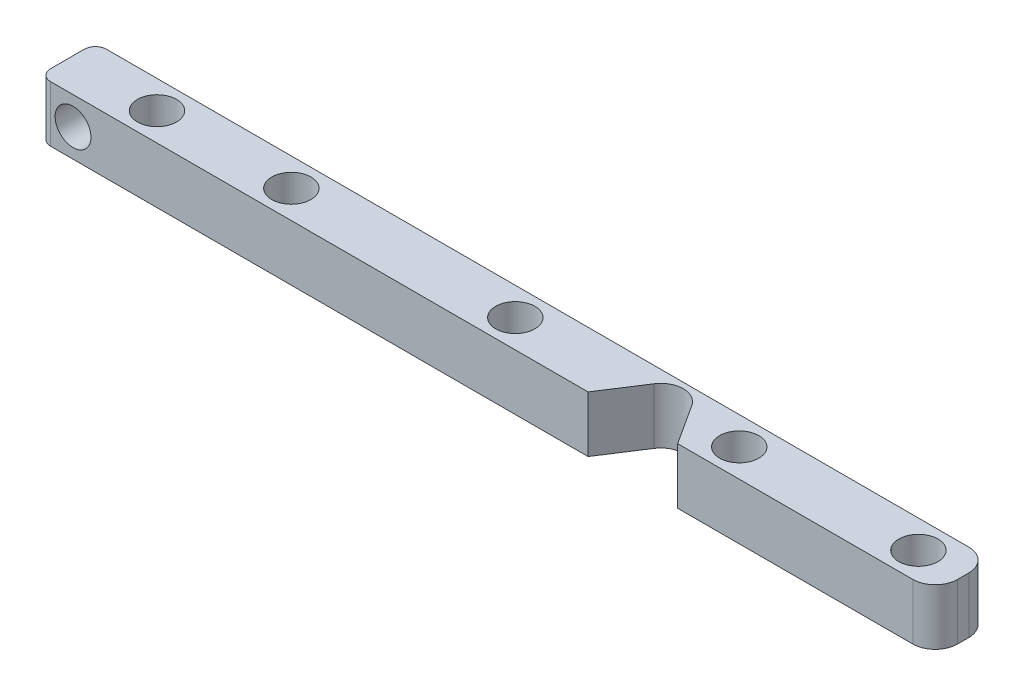
ISO-10303-21;
HEADER;
FILE_DESCRIPTION(('STEP AP214'),'2;1');
FILE_NAME('part.step','',(''),(''),'','','');
FILE_SCHEMA(('AUTOMOTIVE_DESIGN { 1 0 10303 214 1 1 1 1 }'));
ENDSEC;
DATA;
#1=APPLICATION_CONTEXT('core data for automotive mechanical design processes');
#2=APPLICATION_PROTOCOL_DEFINITION('international standard','automotive_design',2000,#1);
#3=PRODUCT_CONTEXT('',#1,'mechanical');
#4=PRODUCT('Part','Part','',(#3));
#5=PRODUCT_RELATED_PRODUCT_CATEGORY('part','',(#4));
#6=PRODUCT_DEFINITION_FORMATION('','',#4);
#7=PRODUCT_DEFINITION_CONTEXT('part definition',#1,'design');
#8=PRODUCT_DEFINITION('design','',#6,#7);
#9=PRODUCT_DEFINITION_SHAPE('','',#8);
#10=(LENGTH_UNIT() NAMED_UNIT(*) SI_UNIT(.MILLI.,.METRE.));
#11=(NAMED_UNIT(*) PLANE_ANGLE_UNIT() SI_UNIT($,.RADIAN.));
#12=(NAMED_UNIT(*) SI_UNIT($,.STERADIAN.) SOLID_ANGLE_UNIT());
#13=UNCERTAINTY_MEASURE_WITH_UNIT(LENGTH_MEASURE(1.E-05),#10,'distance_accuracy_value','');
#14=(GEOMETRIC_REPRESENTATION_CONTEXT(3) GLOBAL_UNCERTAINTY_ASSIGNED_CONTEXT((#13)) GLOBAL_UNIT_ASSIGNED_CONTEXT((#10,
#11,#12)) REPRESENTATION_CONTEXT('',''));
#15=CARTESIAN_POINT('',(0.,0.,0.));
#16=DIRECTION('',(0.,0.,1.));
#17=DIRECTION('',(1.,0.,0.));
#18=AXIS2_PLACEMENT_3D('',#15,#16,#17);
#19=CARTESIAN_POINT('',(0.,6.35,3.175));
#20=DIRECTION('',(0.,0.,-1.));
#21=DIRECTION('',(-1.,0.,0.));
#22=AXIS2_PLACEMENT_3D('',#19,#20,#21);
#23=PLANE('',#22);
#24=DIRECTION('',(0.,1.,0.));
#25=VECTOR('',#24,1.);
#26=CARTESIAN_POINT('',(21.59,-0.00100000000000013,3.175));
#27=LINE('',#26,#25);
#28=CARTESIAN_POINT('',(21.59,0.,3.175));
#29=VERTEX_POINT('',#28);
#30=CARTESIAN_POINT('',(21.59,6.35,3.175));
#31=VERTEX_POINT('',#30);
#32=EDGE_CURVE('E177',#29,#31,#27,.T.);
#33=ORIENTED_EDGE('',*,*,#32,.F.);
#34=DIRECTION('',(1.,0.,0.));
#35=VECTOR('',#34,1.);
#36=CARTESIAN_POINT('',(0.,0.,3.175));
#37=LINE('',#36,#35);
#38=CARTESIAN_POINT('',(48.26,0.,3.175));
#39=VERTEX_POINT('',#38);
#40=EDGE_CURVE('E245',#29,#39,#37,.T.);
#41=ORIENTED_EDGE('',*,*,#40,.T.);
#42=DIRECTION('',(0.,-1.,0.));
#43=VECTOR('',#42,1.);
#44=CARTESIAN_POINT('',(48.26,6.35,3.175));
#45=LINE('',#44,#43);
#46=CARTESIAN_POINT('',(48.26,6.35,3.175));
#47=VERTEX_POINT('',#46);
#48=EDGE_CURVE('E265',#39,#47,#45,.F.);
#49=ORIENTED_EDGE('',*,*,#48,.T.);
#50=DIRECTION('',(1.,0.,0.));
#51=VECTOR('',#50,1.);
#52=CARTESIAN_POINT('',(0.,6.35,3.175));
#53=LINE('',#52,#51);
#54=EDGE_CURVE('E235',#31,#47,#53,.T.);
#55=ORIENTED_EDGE('',*,*,#54,.F.);
#56=EDGE_LOOP('',(#33,#41,#49,#55));
#57=FACE_BOUND('',#56,.T.);
#58=ADVANCED_FACE('F59',(#57),#23,.F.);
#59=CARTESIAN_POINT('',(0.,6.35,0.));
#60=DIRECTION('',(0.,1.,0.));
#61=DIRECTION('',(0.,0.,1.));
#62=AXIS2_PLACEMENT_3D('',#59,#60,#61);
#63=PLANE('',#62);
#64=CARTESIAN_POINT('',(-40.64,6.35,0.));
#65=DIRECTION('',(0.,1.,0.));
#66=DIRECTION('',(0.,0.,1.));
#67=AXIS2_PLACEMENT_3D('',#64,#65,#66);
#68=CIRCLE('',#67,2.2225);
#69=CARTESIAN_POINT('',(-40.64,6.35,2.2225));
#70=VERTEX_POINT('',#69);
#71=EDGE_CURVE('E195',#70,#70,#68,.T.);
#72=ORIENTED_EDGE('',*,*,#71,.F.);
#73=EDGE_LOOP('',(#72));
#74=FACE_BOUND('',#73,.T.);
#75=CARTESIAN_POINT('',(-25.4,6.35,0.));
#76=DIRECTION('',(0.,1.,0.));
#77=DIRECTION('',(0.,0.,1.));
#78=AXIS2_PLACEMENT_3D('',#75,#76,#77);
#79=CIRCLE('',#78,2.2225);
#80=CARTESIAN_POINT('',(-25.4,6.35,2.2225));
#81=VERTEX_POINT('',#80);
#82=EDGE_CURVE('E198',#81,#81,#79,.T.);
#83=ORIENTED_EDGE('',*,*,#82,.F.);
#84=EDGE_LOOP('',(#83));
#85=FACE_BOUND('',#84,.T.);
#86=CARTESIAN_POINT('',(0.,6.35,0.));
#87=DIRECTION('',(0.,1.,0.));
#88=DIRECTION('',(0.,0.,1.));
#89=AXIS2_PLACEMENT_3D('',#86,#87,#88);
#90=CIRCLE('',#89,2.2225);
#91=CARTESIAN_POINT('',(0.,6.35,2.2225));
#92=VERTEX_POINT('',#91);
#93=EDGE_CURVE('E201',#92,#92,#90,.T.);
#94=ORIENTED_EDGE('',*,*,#93,.F.);
#95=EDGE_LOOP('',(#94));
#96=FACE_BOUND('',#95,.T.);
#97=CARTESIAN_POINT('',(25.4,6.35,0.));
#98=DIRECTION('',(0.,1.,0.));
#99=DIRECTION('',(0.,0.,1.));
#100=AXIS2_PLACEMENT_3D('',#97,#98,#99);
#101=CIRCLE('',#100,2.2225);
#102=CARTESIAN_POINT('',(25.4,6.35,2.2225));
#103=VERTEX_POINT('',#102);
#104=EDGE_CURVE('E207',#103,#103,#101,.T.);
#105=ORIENTED_EDGE('',*,*,#104,.F.);
#106=EDGE_LOOP('',(#105));
#107=FACE_BOUND('',#106,.T.);
#108=CARTESIAN_POINT('',(45.72,6.35,0.));
#109=DIRECTION('',(0.,1.,0.));
#110=DIRECTION('',(0.,0.,1.));
#111=AXIS2_PLACEMENT_3D('',#108,#109,#110);
#112=CIRCLE('',#111,2.2225);
#113=CARTESIAN_POINT('',(45.72,6.35,2.2225));
#114=VERTEX_POINT('',#113);
#115=EDGE_CURVE('E216',#114,#114,#112,.T.);
#116=ORIENTED_EDGE('',*,*,#115,.F.);
#117=EDGE_LOOP('',(#116));
#118=FACE_BOUND('',#117,.T.);
#119=CARTESIAN_POINT('',(16.51,6.35,0.));
#120=DIRECTION('',(0.,1.,0.));
#121=DIRECTION('',(0.,0.,1.));
#122=AXIS2_PLACEMENT_3D('',#119,#120,#121);
#123=CIRCLE('',#122,2.54);
#124=CARTESIAN_POINT('',(18.6424589614105,6.35,-1.37993433825677));
#125=VERTEX_POINT('',#124);
#126=CARTESIAN_POINT('',(14.3775410385895,6.35,-1.37993433825677));
#127=VERTEX_POINT('',#126);
#128=EDGE_CURVE('E161',#125,#127,#123,.T.);
#129=ORIENTED_EDGE('',*,*,#128,.F.);
#130=DIRECTION('',(0.543281235534161,0.,0.83955077220885));
#131=VECTOR('',#130,1.);
#132=CARTESIAN_POINT('',(13.7694581518235,6.35,-8.91034644358312));
#133=LINE('',#132,#131);
#134=EDGE_CURVE('E158',#125,#31,#133,.T.);
#135=ORIENTED_EDGE('',*,*,#134,.T.);
#136=ORIENTED_EDGE('',*,*,#54,.T.);
#137=CARTESIAN_POINT('',(48.26,6.35,0.635));
#138=DIRECTION('',(0.,1.,0.));
#139=DIRECTION('',(0.,0.,1.));
#140=AXIS2_PLACEMENT_3D('',#137,#138,#139);
#141=CIRCLE('',#140,2.54);
#142=CARTESIAN_POINT('',(50.8,6.35,0.635));
#143=VERTEX_POINT('',#142);
#144=EDGE_CURVE('E260',#47,#143,#141,.T.);
#145=ORIENTED_EDGE('',*,*,#144,.T.);
#146=DIRECTION('',(0.,0.,1.));
#147=VECTOR('',#146,1.);
#148=CARTESIAN_POINT('',(50.8,6.35,0.));
#149=LINE('',#148,#147);
#150=CARTESIAN_POINT('',(50.8,6.35,-0.635));
#151=VERTEX_POINT('',#150);
#152=EDGE_CURVE('E221',#151,#143,#149,.T.);
#153=ORIENTED_EDGE('',*,*,#152,.F.);
#154=CARTESIAN_POINT('',(48.26,6.35,-0.635));
#155=DIRECTION('',(0.,1.,0.));
#156=DIRECTION('',(0.,0.,1.));
#157=AXIS2_PLACEMENT_3D('',#154,#155,#156);
#158=CIRCLE('',#157,2.54);
#159=CARTESIAN_POINT('',(48.26,6.35,-3.175));
#160=VERTEX_POINT('',#159);
#161=EDGE_CURVE('E259',#151,#160,#158,.T.);
#162=ORIENTED_EDGE('',*,*,#161,.T.);
#163=DIRECTION('',(1.,0.,0.));
#164=VECTOR('',#163,1.);
#165=CARTESIAN_POINT('',(0.,6.35,-3.175));
#166=LINE('',#165,#164);
#167=CARTESIAN_POINT('',(-49.53,6.35,-3.175));
#168=VERTEX_POINT('',#167);
#169=EDGE_CURVE('E230',#168,#160,#166,.T.);
#170=ORIENTED_EDGE('',*,*,#169,.F.);
#171=CARTESIAN_POINT('',(-49.53,6.35,-1.905));
#172=DIRECTION('',(0.,1.,0.));
#173=DIRECTION('',(0.,0.,1.));
#174=AXIS2_PLACEMENT_3D('',#171,#172,#173);
#175=CIRCLE('',#174,1.27);
#176=CARTESIAN_POINT('',(-50.8,6.35,-1.905));
#177=VERTEX_POINT('',#176);
#178=EDGE_CURVE('E66',#168,#177,#175,.T.);
#179=ORIENTED_EDGE('',*,*,#178,.T.);
#180=DIRECTION('',(0.,0.,1.));
#181=VECTOR('',#180,1.);
#182=CARTESIAN_POINT('',(-50.8,6.35,0.));
#183=LINE('',#182,#181);
#184=CARTESIAN_POINT('',(-50.8,6.35,1.905));
#185=VERTEX_POINT('',#184);
#186=EDGE_CURVE('E226',#177,#185,#183,.T.);
#187=ORIENTED_EDGE('',*,*,#186,.T.);
#188=CARTESIAN_POINT('',(-49.53,6.35,1.905));
#189=DIRECTION('',(0.,1.,0.));
#190=DIRECTION('',(0.,0.,1.));
#191=AXIS2_PLACEMENT_3D('',#188,#189,#190);
#192=CIRCLE('',#191,1.27);
#193=CARTESIAN_POINT('',(-49.53,6.35,3.175));
#194=VERTEX_POINT('',#193);
#195=EDGE_CURVE('E81',#185,#194,#192,.T.);
#196=ORIENTED_EDGE('',*,*,#195,.T.);
#197=CARTESIAN_POINT('',(11.43,6.35,3.175));
#198=VERTEX_POINT('',#197);
#199=EDGE_CURVE('E166',#194,#198,#53,.T.);
#200=ORIENTED_EDGE('',*,*,#199,.T.);
#201=DIRECTION('',(-0.54328123553416,0.,0.83955077220885));
#202=VECTOR('',#201,1.);
#203=CARTESIAN_POINT('',(9.50454022900255,6.35,6.15047776706958));
#204=LINE('',#203,#202);
#205=EDGE_CURVE('E155',#127,#198,#204,.T.);
#206=ORIENTED_EDGE('',*,*,#205,.F.);
#207=EDGE_LOOP('',(#129,#135,#136,#145,#153,#162,#170,#179,#187,#196,#200,#206));
#208=FACE_BOUND('',#207,.T.);
#209=ADVANCED_FACE('F169',(#74,#85,#96,#107,#118,#208),#63,.T.);
#210=CARTESIAN_POINT('',(50.8,6.35,0.));
#211=DIRECTION('',(1.,0.,0.));
#212=DIRECTION('',(0.,0.,-1.));
#213=AXIS2_PLACEMENT_3D('',#210,#211,#212);
#214=PLANE('',#213);
#215=DIRECTION('',(0.,0.,1.));
#216=VECTOR('',#215,1.);
#217=CARTESIAN_POINT('',(50.8,0.,0.));
#218=LINE('',#217,#216);
#219=CARTESIAN_POINT('',(50.8,0.,-0.635));
#220=VERTEX_POINT('',#219);
#221=CARTESIAN_POINT('',(50.8,0.,0.635));
#222=VERTEX_POINT('',#221);
#223=EDGE_CURVE('E200',#220,#222,#218,.T.);
#224=ORIENTED_EDGE('',*,*,#223,.F.);
#225=DIRECTION('',(0.,-1.,0.));
#226=VECTOR('',#225,1.);
#227=CARTESIAN_POINT('',(50.8,6.35,-0.635));
#228=LINE('',#227,#226);
#229=EDGE_CURVE('E254',#220,#151,#228,.F.);
#230=ORIENTED_EDGE('',*,*,#229,.T.);
#231=ORIENTED_EDGE('',*,*,#152,.T.);
#232=DIRECTION('',(0.,-1.,0.));
#233=VECTOR('',#232,1.);
#234=CARTESIAN_POINT('',(50.8,0.,0.635));
#235=LINE('',#234,#233);
#236=EDGE_CURVE('E252',#143,#222,#235,.T.);
#237=ORIENTED_EDGE('',*,*,#236,.T.);
#238=EDGE_LOOP('',(#224,#230,#231,#237));
#239=FACE_BOUND('',#238,.T.);
#240=ADVANCED_FACE('F301',(#239),#214,.T.);
#241=CARTESIAN_POINT('',(0.,6.35,-3.175));
#242=DIRECTION('',(0.,0.,-1.));
#243=DIRECTION('',(-1.,0.,0.));
#244=AXIS2_PLACEMENT_3D('',#241,#242,#243);
#245=PLANE('',#244);
#246=CARTESIAN_POINT('',(-46.99,3.175,-3.175));
#247=DIRECTION('',(0.,0.,-1.));
#248=DIRECTION('',(-1.,0.,0.));
#249=AXIS2_PLACEMENT_3D('',#246,#247,#248);
#250=CIRCLE('',#249,2.032);
#251=CARTESIAN_POINT('',(-49.022,3.175,-3.175));
#252=VERTEX_POINT('',#251);
#253=EDGE_CURVE('E181',#252,#252,#250,.F.);
#254=ORIENTED_EDGE('',*,*,#253,.T.);
#255=EDGE_LOOP('',(#254));
#256=FACE_BOUND('',#255,.T.);
#257=DIRECTION('',(1.,0.,0.));
#258=VECTOR('',#257,1.);
#259=CARTESIAN_POINT('',(0.,0.,-3.175));
#260=LINE('',#259,#258);
#261=CARTESIAN_POINT('',(-49.53,0.,-3.175));
#262=VERTEX_POINT('',#261);
#263=CARTESIAN_POINT('',(48.26,0.,-3.175));
#264=VERTEX_POINT('',#263);
#265=EDGE_CURVE('E240',#262,#264,#260,.T.);
#266=ORIENTED_EDGE('',*,*,#265,.F.);
#267=DIRECTION('',(0.,-1.,0.));
#268=VECTOR('',#267,1.);
#269=CARTESIAN_POINT('',(-49.53,6.35,-3.175));
#270=LINE('',#269,#268);
#271=EDGE_CURVE('E273',#262,#168,#270,.F.);
#272=ORIENTED_EDGE('',*,*,#271,.T.);
#273=ORIENTED_EDGE('',*,*,#169,.T.);
#274=DIRECTION('',(0.,-1.,0.));
#275=VECTOR('',#274,1.);
#276=CARTESIAN_POINT('',(48.26,6.35,-3.175));
#277=LINE('',#276,#275);
#278=EDGE_CURVE('E232',#160,#264,#277,.T.);
#279=ORIENTED_EDGE('',*,*,#278,.T.);
#280=EDGE_LOOP('',(#266,#272,#273,#279));
#281=FACE_BOUND('',#280,.T.);
#282=ADVANCED_FACE('F291',(#256,#281),#245,.T.);
#283=CARTESIAN_POINT('',(-50.8,6.35,0.));
#284=DIRECTION('',(1.,0.,0.));
#285=DIRECTION('',(0.,0.,-1.));
#286=AXIS2_PLACEMENT_3D('',#283,#284,#285);
#287=PLANE('',#286);
#288=ORIENTED_EDGE('',*,*,#186,.F.);
#289=DIRECTION('',(0.,-1.,0.));
#290=VECTOR('',#289,1.);
#291=CARTESIAN_POINT('',(-50.8,0.,-1.905));
#292=LINE('',#291,#290);
#293=CARTESIAN_POINT('',(-50.8,0.,-1.905));
#294=VERTEX_POINT('',#293);
#295=EDGE_CURVE('E270',#177,#294,#292,.T.);
#296=ORIENTED_EDGE('',*,*,#295,.T.);
#297=DIRECTION('',(0.,0.,1.));
#298=VECTOR('',#297,1.);
#299=CARTESIAN_POINT('',(-50.8,0.,0.));
#300=LINE('',#299,#298);
#301=CARTESIAN_POINT('',(-50.8,0.,1.905));
#302=VERTEX_POINT('',#301);
#303=EDGE_CURVE('E239',#294,#302,#300,.T.);
#304=ORIENTED_EDGE('',*,*,#303,.T.);
#305=DIRECTION('',(0.,-1.,0.));
#306=VECTOR('',#305,1.);
#307=CARTESIAN_POINT('',(-50.8,6.35,1.905));
#308=LINE('',#307,#306);
#309=EDGE_CURVE('E264',#302,#185,#308,.F.);
#310=ORIENTED_EDGE('',*,*,#309,.T.);
#311=EDGE_LOOP('',(#288,#296,#304,#310));
#312=FACE_BOUND('',#311,.T.);
#313=ADVANCED_FACE('F283',(#312),#287,.F.);
#314=CARTESIAN_POINT('',(-46.99,3.175,3.175));
#315=DIRECTION('',(0.,0.,1.));
#316=DIRECTION('',(1.,0.,0.));
#317=AXIS2_PLACEMENT_3D('',#314,#315,#316);
#318=CIRCLE('',#317,2.032);
#319=CARTESIAN_POINT('',(-44.958,3.175,3.175));
#320=VERTEX_POINT('',#319);
#321=EDGE_CURVE('E187',#320,#320,#318,.T.);
#322=ORIENTED_EDGE('',*,*,#321,.F.);
#323=EDGE_LOOP('',(#322));
#324=FACE_BOUND('',#323,.T.);
#325=CARTESIAN_POINT('',(-49.53,0.,3.175));
#326=VERTEX_POINT('',#325);
#327=CARTESIAN_POINT('',(11.43,0.,3.175));
#328=VERTEX_POINT('',#327);
#329=EDGE_CURVE('E228',#326,#328,#37,.T.);
#330=ORIENTED_EDGE('',*,*,#329,.T.);
#331=DIRECTION('',(0.,1.,0.));
#332=VECTOR('',#331,1.);
#333=CARTESIAN_POINT('',(11.43,-0.00100000000000013,3.175));
#334=LINE('',#333,#332);
#335=EDGE_CURVE('E160',#328,#198,#334,.T.);
#336=ORIENTED_EDGE('',*,*,#335,.T.);
#337=ORIENTED_EDGE('',*,*,#199,.F.);
#338=DIRECTION('',(0.,-1.,0.));
#339=VECTOR('',#338,1.);
#340=CARTESIAN_POINT('',(-49.53,6.35,3.175));
#341=LINE('',#340,#339);
#342=EDGE_CURVE('E12',#194,#326,#341,.T.);
#343=ORIENTED_EDGE('',*,*,#342,.T.);
#344=EDGE_LOOP('',(#330,#336,#337,#343));
#345=FACE_BOUND('',#344,.T.);
#346=ADVANCED_FACE('F312',(#324,#345),#23,.F.);
#347=CARTESIAN_POINT('',(0.,0.,0.));
#348=DIRECTION('',(0.,1.,0.));
#349=DIRECTION('',(0.,0.,1.));
#350=AXIS2_PLACEMENT_3D('',#347,#348,#349);
#351=PLANE('',#350);
#352=CARTESIAN_POINT('',(-40.64,0.,0.));
#353=DIRECTION('',(0.,1.,0.));
#354=DIRECTION('',(0.,0.,1.));
#355=AXIS2_PLACEMENT_3D('',#352,#353,#354);
#356=CIRCLE('',#355,2.2225);
#357=CARTESIAN_POINT('',(-40.64,0.,2.2225));
#358=VERTEX_POINT('',#357);
#359=EDGE_CURVE('E194',#358,#358,#356,.F.);
#360=ORIENTED_EDGE('',*,*,#359,.F.);
#361=EDGE_LOOP('',(#360));
#362=FACE_BOUND('',#361,.T.);
#363=CARTESIAN_POINT('',(-25.4,0.,0.));
#364=DIRECTION('',(0.,1.,0.));
#365=DIRECTION('',(0.,0.,1.));
#366=AXIS2_PLACEMENT_3D('',#363,#364,#365);
#367=CIRCLE('',#366,2.2225);
#368=CARTESIAN_POINT('',(-25.4,0.,2.2225));
#369=VERTEX_POINT('',#368);
#370=EDGE_CURVE('E199',#369,#369,#367,.F.);
#371=ORIENTED_EDGE('',*,*,#370,.F.);
#372=EDGE_LOOP('',(#371));
#373=FACE_BOUND('',#372,.T.);
#374=CARTESIAN_POINT('',(0.,0.,0.));
#375=DIRECTION('',(0.,1.,0.));
#376=DIRECTION('',(0.,0.,1.));
#377=AXIS2_PLACEMENT_3D('',#374,#375,#376);
#378=CIRCLE('',#377,2.2225);
#379=CARTESIAN_POINT('',(0.,0.,2.2225));
#380=VERTEX_POINT('',#379);
#381=EDGE_CURVE('E206',#380,#380,#378,.F.);
#382=ORIENTED_EDGE('',*,*,#381,.F.);
#383=EDGE_LOOP('',(#382));
#384=FACE_BOUND('',#383,.T.);
#385=CARTESIAN_POINT('',(25.4,0.,0.));
#386=DIRECTION('',(0.,1.,0.));
#387=DIRECTION('',(0.,0.,1.));
#388=AXIS2_PLACEMENT_3D('',#385,#386,#387);
#389=CIRCLE('',#388,2.2225);
#390=CARTESIAN_POINT('',(25.4,0.,2.2225));
#391=VERTEX_POINT('',#390);
#392=EDGE_CURVE('E215',#391,#391,#389,.F.);
#393=ORIENTED_EDGE('',*,*,#392,.F.);
#394=EDGE_LOOP('',(#393));
#395=FACE_BOUND('',#394,.T.);
#396=CARTESIAN_POINT('',(45.72,0.,0.));
#397=DIRECTION('',(0.,1.,0.));
#398=DIRECTION('',(0.,0.,1.));
#399=AXIS2_PLACEMENT_3D('',#396,#397,#398);
#400=CIRCLE('',#399,2.2225);
#401=CARTESIAN_POINT('',(45.72,0.,2.2225));
#402=VERTEX_POINT('',#401);
#403=EDGE_CURVE('E189',#402,#402,#400,.F.);
#404=ORIENTED_EDGE('',*,*,#403,.F.);
#405=EDGE_LOOP('',(#404));
#406=FACE_BOUND('',#405,.T.);
#407=ORIENTED_EDGE('',*,*,#40,.F.);
#408=DIRECTION('',(-0.543281235534161,0.,-0.83955077220885));
#409=VECTOR('',#408,1.);
#410=CARTESIAN_POINT('',(13.7694581518235,0.,-8.91034644358312));
#411=LINE('',#410,#409);
#412=CARTESIAN_POINT('',(18.6424589614105,0.,-1.37993433825677));
#413=VERTEX_POINT('',#412);
#414=EDGE_CURVE('E168',#29,#413,#411,.T.);
#415=ORIENTED_EDGE('',*,*,#414,.T.);
#416=CARTESIAN_POINT('',(16.51,0.,0.));
#417=DIRECTION('',(0.,1.,0.));
#418=DIRECTION('',(0.,0.,1.));
#419=AXIS2_PLACEMENT_3D('',#416,#417,#418);
#420=CIRCLE('',#419,2.54);
#421=CARTESIAN_POINT('',(14.3775410385895,0.,-1.37993433825677));
#422=VERTEX_POINT('',#421);
#423=EDGE_CURVE('E167',#422,#413,#420,.F.);
#424=ORIENTED_EDGE('',*,*,#423,.F.);
#425=DIRECTION('',(0.54328123553416,0.,-0.83955077220885));
#426=VECTOR('',#425,1.);
#427=CARTESIAN_POINT('',(9.50454022900255,0.,6.15047776706958));
#428=LINE('',#427,#426);
#429=EDGE_CURVE('E71',#328,#422,#428,.T.);
#430=ORIENTED_EDGE('',*,*,#429,.F.);
#431=ORIENTED_EDGE('',*,*,#329,.F.);
#432=CARTESIAN_POINT('',(-49.53,0.,1.905));
#433=DIRECTION('',(0.,1.,0.));
#434=DIRECTION('',(0.,0.,1.));
#435=AXIS2_PLACEMENT_3D('',#432,#433,#434);
#436=CIRCLE('',#435,1.27);
#437=EDGE_CURVE('E269',#326,#302,#436,.F.);
#438=ORIENTED_EDGE('',*,*,#437,.T.);
#439=ORIENTED_EDGE('',*,*,#303,.F.);
#440=CARTESIAN_POINT('',(-49.53,0.,-1.905));
#441=DIRECTION('',(0.,1.,0.));
#442=DIRECTION('',(0.,0.,1.));
#443=AXIS2_PLACEMENT_3D('',#440,#441,#442);
#444=CIRCLE('',#443,1.27);
#445=EDGE_CURVE('E275',#294,#262,#444,.F.);
#446=ORIENTED_EDGE('',*,*,#445,.T.);
#447=ORIENTED_EDGE('',*,*,#265,.T.);
#448=CARTESIAN_POINT('',(48.26,0.,-0.635));
#449=DIRECTION('',(0.,1.,0.));
#450=DIRECTION('',(0.,0.,1.));
#451=AXIS2_PLACEMENT_3D('',#448,#449,#450);
#452=CIRCLE('',#451,2.54);
#453=EDGE_CURVE('E249',#264,#220,#452,.F.);
#454=ORIENTED_EDGE('',*,*,#453,.T.);
#455=ORIENTED_EDGE('',*,*,#223,.T.);
#456=CARTESIAN_POINT('',(48.26,0.,0.635));
#457=DIRECTION('',(0.,1.,0.));
#458=DIRECTION('',(0.,0.,1.));
#459=AXIS2_PLACEMENT_3D('',#456,#457,#458);
#460=CIRCLE('',#459,2.54);
#461=EDGE_CURVE('E250',#222,#39,#460,.F.);
#462=ORIENTED_EDGE('',*,*,#461,.T.);
#463=EDGE_LOOP('',(#407,#415,#424,#430,#431,#438,#439,#446,#447,#454,#455,#462));
#464=FACE_BOUND('',#463,.T.);
#465=ADVANCED_FACE('F289',(#362,#373,#384,#395,#406,#464),#351,.F.);
#466=CARTESIAN_POINT('',(48.26,6.35,-0.635));
#467=DIRECTION('',(0.,-1.,0.));
#468=DIRECTION('',(0.,0.,-1.));
#469=AXIS2_PLACEMENT_3D('',#466,#467,#468);
#470=CYLINDRICAL_SURFACE('',#469,2.54);
#471=ORIENTED_EDGE('',*,*,#161,.F.);
#472=ORIENTED_EDGE('',*,*,#229,.F.);
#473=ORIENTED_EDGE('',*,*,#453,.F.);
#474=ORIENTED_EDGE('',*,*,#278,.F.);
#475=EDGE_LOOP('',(#471,#472,#473,#474));
#476=FACE_BOUND('',#475,.T.);
#477=ADVANCED_FACE('F300',(#476),#470,.T.);
#478=CARTESIAN_POINT('',(48.26,6.35,0.635));
#479=DIRECTION('',(0.,1.,0.));
#480=DIRECTION('',(0.,0.,1.));
#481=AXIS2_PLACEMENT_3D('',#478,#479,#480);
#482=CYLINDRICAL_SURFACE('',#481,2.54);
#483=ORIENTED_EDGE('',*,*,#144,.F.);
#484=ORIENTED_EDGE('',*,*,#48,.F.);
#485=ORIENTED_EDGE('',*,*,#461,.F.);
#486=ORIENTED_EDGE('',*,*,#236,.F.);
#487=EDGE_LOOP('',(#483,#484,#485,#486));
#488=FACE_BOUND('',#487,.T.);
#489=ADVANCED_FACE('F308',(#488),#482,.T.);
#490=CARTESIAN_POINT('',(-49.53,6.35,-1.905));
#491=DIRECTION('',(0.,1.,0.));
#492=DIRECTION('',(0.,0.,1.));
#493=AXIS2_PLACEMENT_3D('',#490,#491,#492);
#494=CYLINDRICAL_SURFACE('',#493,1.27);
#495=ORIENTED_EDGE('',*,*,#178,.F.);
#496=ORIENTED_EDGE('',*,*,#271,.F.);
#497=ORIENTED_EDGE('',*,*,#445,.F.);
#498=ORIENTED_EDGE('',*,*,#295,.F.);
#499=EDGE_LOOP('',(#495,#496,#497,#498));
#500=FACE_BOUND('',#499,.T.);
#501=ADVANCED_FACE('F286',(#500),#494,.T.);
#502=CARTESIAN_POINT('',(-49.53,6.35,1.905));
#503=DIRECTION('',(0.,-1.,0.));
#504=DIRECTION('',(0.,0.,-1.));
#505=AXIS2_PLACEMENT_3D('',#502,#503,#504);
#506=CYLINDRICAL_SURFACE('',#505,1.27);
#507=ORIENTED_EDGE('',*,*,#195,.F.);
#508=ORIENTED_EDGE('',*,*,#309,.F.);
#509=ORIENTED_EDGE('',*,*,#437,.F.);
#510=ORIENTED_EDGE('',*,*,#342,.F.);
#511=EDGE_LOOP('',(#507,#508,#509,#510));
#512=FACE_BOUND('',#511,.T.);
#513=ADVANCED_FACE('F58',(#512),#506,.T.);
#514=CARTESIAN_POINT('',(45.72,-0.00100000000000013,0.));
#515=DIRECTION('',(0.,1.,0.));
#516=DIRECTION('',(0.,0.,1.));
#517=AXIS2_PLACEMENT_3D('',#514,#515,#516);
#518=CYLINDRICAL_SURFACE('',#517,2.2225);
#519=ORIENTED_EDGE('',*,*,#115,.T.);
#520=EDGE_LOOP('',(#519));
#521=FACE_BOUND('',#520,.T.);
#522=ORIENTED_EDGE('',*,*,#403,.T.);
#523=EDGE_LOOP('',(#522));
#524=FACE_BOUND('',#523,.T.);
#525=ADVANCED_FACE('F340',(#521,#524),#518,.F.);
#526=CARTESIAN_POINT('',(25.4,-0.00100000000000013,0.));
#527=DIRECTION('',(0.,1.,0.));
#528=DIRECTION('',(0.,0.,1.));
#529=AXIS2_PLACEMENT_3D('',#526,#527,#528);
#530=CYLINDRICAL_SURFACE('',#529,2.2225);
#531=ORIENTED_EDGE('',*,*,#104,.T.);
#532=EDGE_LOOP('',(#531));
#533=FACE_BOUND('',#532,.T.);
#534=ORIENTED_EDGE('',*,*,#392,.T.);
#535=EDGE_LOOP('',(#534));
#536=FACE_BOUND('',#535,.T.);
#537=ADVANCED_FACE('F345',(#533,#536),#530,.F.);
#538=CARTESIAN_POINT('',(0.,-0.00100000000000013,0.));
#539=DIRECTION('',(0.,1.,0.));
#540=DIRECTION('',(0.,0.,1.));
#541=AXIS2_PLACEMENT_3D('',#538,#539,#540);
#542=CYLINDRICAL_SURFACE('',#541,2.2225);
#543=ORIENTED_EDGE('',*,*,#93,.T.);
#544=EDGE_LOOP('',(#543));
#545=FACE_BOUND('',#544,.T.);
#546=ORIENTED_EDGE('',*,*,#381,.T.);
#547=EDGE_LOOP('',(#546));
#548=FACE_BOUND('',#547,.T.);
#549=ADVANCED_FACE('F435',(#545,#548),#542,.F.);
#550=CARTESIAN_POINT('',(-25.4,-0.00100000000000013,0.));
#551=DIRECTION('',(0.,1.,0.));
#552=DIRECTION('',(0.,0.,1.));
#553=AXIS2_PLACEMENT_3D('',#550,#551,#552);
#554=CYLINDRICAL_SURFACE('',#553,2.2225);
#555=ORIENTED_EDGE('',*,*,#82,.T.);
#556=EDGE_LOOP('',(#555));
#557=FACE_BOUND('',#556,.T.);
#558=ORIENTED_EDGE('',*,*,#370,.T.);
#559=EDGE_LOOP('',(#558));
#560=FACE_BOUND('',#559,.T.);
#561=ADVANCED_FACE('F371',(#557,#560),#554,.F.);
#562=CARTESIAN_POINT('',(-40.64,-0.00100000000000013,0.));
#563=DIRECTION('',(0.,1.,0.));
#564=DIRECTION('',(0.,0.,1.));
#565=AXIS2_PLACEMENT_3D('',#562,#563,#564);
#566=CYLINDRICAL_SURFACE('',#565,2.2225);
#567=ORIENTED_EDGE('',*,*,#71,.T.);
#568=EDGE_LOOP('',(#567));
#569=FACE_BOUND('',#568,.T.);
#570=ORIENTED_EDGE('',*,*,#359,.T.);
#571=EDGE_LOOP('',(#570));
#572=FACE_BOUND('',#571,.T.);
#573=ADVANCED_FACE('F365',(#569,#572),#566,.F.);
#574=CARTESIAN_POINT('',(-46.99,3.175,-3.176));
#575=DIRECTION('',(0.,0.,1.));
#576=DIRECTION('',(1.,0.,0.));
#577=AXIS2_PLACEMENT_3D('',#574,#575,#576);
#578=CYLINDRICAL_SURFACE('',#577,2.032);
#579=ORIENTED_EDGE('',*,*,#253,.F.);
#580=EDGE_LOOP('',(#579));
#581=FACE_BOUND('',#580,.T.);
#582=ORIENTED_EDGE('',*,*,#321,.T.);
#583=EDGE_LOOP('',(#582));
#584=FACE_BOUND('',#583,.T.);
#585=ADVANCED_FACE('F363',(#581,#584),#578,.F.);
#586=CARTESIAN_POINT('',(13.7694581518235,-0.00100000000000013,-8.91034644358312));
#587=DIRECTION('',(-0.83955077220885,0.,0.543281235534161));
#588=DIRECTION('',(0.543281235534161,0.,0.83955077220885));
#589=AXIS2_PLACEMENT_3D('',#586,#587,#588);
#590=PLANE('',#589);
#591=ORIENTED_EDGE('',*,*,#32,.T.);
#592=ORIENTED_EDGE('',*,*,#134,.F.);
#593=DIRECTION('',(0.,1.,0.));
#594=VECTOR('',#593,1.);
#595=CARTESIAN_POINT('',(18.6424589614105,-0.00100000000000013,-1.37993433825677));
#596=LINE('',#595,#594);
#597=EDGE_CURVE('E162',#413,#125,#596,.T.);
#598=ORIENTED_EDGE('',*,*,#597,.F.);
#599=ORIENTED_EDGE('',*,*,#414,.F.);
#600=EDGE_LOOP('',(#591,#592,#598,#599));
#601=FACE_BOUND('',#600,.T.);
#602=ADVANCED_FACE('F361',(#601),#590,.T.);
#603=CARTESIAN_POINT('',(9.50454022900255,-0.00100000000000013,6.15047776706958));
#604=DIRECTION('',(-0.83955077220885,0.,-0.54328123553416));
#605=DIRECTION('',(-0.54328123553416,0.,0.83955077220885));
#606=AXIS2_PLACEMENT_3D('',#603,#604,#605);
#607=PLANE('',#606);
#608=ORIENTED_EDGE('',*,*,#429,.T.);
#609=DIRECTION('',(0.,1.,0.));
#610=VECTOR('',#609,1.);
#611=CARTESIAN_POINT('',(14.3775410385895,-0.00100000000000013,-1.37993433825677));
#612=LINE('',#611,#610);
#613=EDGE_CURVE('E146',#422,#127,#612,.T.);
#614=ORIENTED_EDGE('',*,*,#613,.T.);
#615=ORIENTED_EDGE('',*,*,#205,.T.);
#616=ORIENTED_EDGE('',*,*,#335,.F.);
#617=EDGE_LOOP('',(#608,#614,#615,#616));
#618=FACE_BOUND('',#617,.T.);
#619=ADVANCED_FACE('F147',(#618),#607,.F.);
#620=CARTESIAN_POINT('',(16.51,-0.00100000000000013,0.));
#621=DIRECTION('',(0.,1.,0.));
#622=DIRECTION('',(0.,0.,1.));
#623=AXIS2_PLACEMENT_3D('',#620,#621,#622);
#624=CYLINDRICAL_SURFACE('',#623,2.54);
#625=ORIENTED_EDGE('',*,*,#597,.T.);
#626=ORIENTED_EDGE('',*,*,#128,.T.);
#627=ORIENTED_EDGE('',*,*,#613,.F.);
#628=ORIENTED_EDGE('',*,*,#423,.T.);
#629=EDGE_LOOP('',(#625,#626,#627,#628));
#630=FACE_BOUND('',#629,.T.);
#631=ADVANCED_FACE('F165',(#630),#624,.F.);
#632=CLOSED_SHELL('',(#58,#209,#240,#282,#313,#346,#465,#477,#489,#501,#513,#525,#537,#549,#561,
#573,#585,#602,#619,#631));
#633=MANIFOLD_SOLID_BREP('B2',#632);
#634=ADVANCED_BREP_SHAPE_REPRESENTATION('',(#18,#633),#14);
#635=SHAPE_DEFINITION_REPRESENTATION(#9,#634);
ENDSEC;
END-ISO-10303-21;
